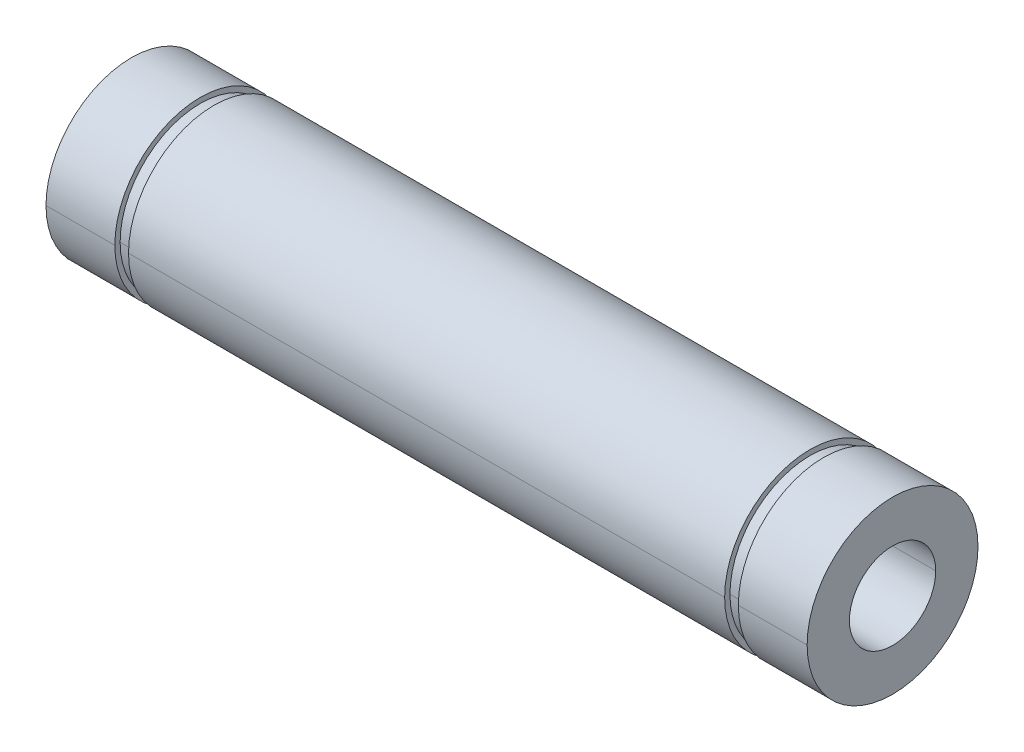
ISO-10303-21;
HEADER;
FILE_DESCRIPTION(('STEP AP214'),'2;1');
FILE_NAME('part.step','',(''),(''),'','','');
FILE_SCHEMA(('AUTOMOTIVE_DESIGN { 1 0 10303 214 1 1 1 1 }'));
ENDSEC;
DATA;
#1=APPLICATION_CONTEXT('core data for automotive mechanical design processes');
#2=APPLICATION_PROTOCOL_DEFINITION('international standard','automotive_design',2000,#1);
#3=PRODUCT_CONTEXT('',#1,'mechanical');
#4=PRODUCT('Part','Part','',(#3));
#5=PRODUCT_RELATED_PRODUCT_CATEGORY('part','',(#4));
#6=PRODUCT_DEFINITION_FORMATION('','',#4);
#7=PRODUCT_DEFINITION_CONTEXT('part definition',#1,'design');
#8=PRODUCT_DEFINITION('design','',#6,#7);
#9=PRODUCT_DEFINITION_SHAPE('','',#8);
#10=(LENGTH_UNIT() NAMED_UNIT(*) SI_UNIT(.MILLI.,.METRE.));
#11=(NAMED_UNIT(*) PLANE_ANGLE_UNIT() SI_UNIT($,.RADIAN.));
#12=(NAMED_UNIT(*) SI_UNIT($,.STERADIAN.) SOLID_ANGLE_UNIT());
#13=UNCERTAINTY_MEASURE_WITH_UNIT(LENGTH_MEASURE(1.E-05),#10,'distance_accuracy_value','');
#14=(GEOMETRIC_REPRESENTATION_CONTEXT(3) GLOBAL_UNCERTAINTY_ASSIGNED_CONTEXT((#13)) GLOBAL_UNIT_ASSIGNED_CONTEXT((#10,
#11,#12)) REPRESENTATION_CONTEXT('',''));
#15=CARTESIAN_POINT('',(0.,0.,0.));
#16=DIRECTION('',(0.,0.,1.));
#17=DIRECTION('',(1.,0.,0.));
#18=AXIS2_PLACEMENT_3D('',#15,#16,#17);
#19=CARTESIAN_POINT('',(28.2321,0.,0.));
#20=DIRECTION('',(1.,0.,0.));
#21=DIRECTION('',(0.,0.,-1.));
#22=AXIS2_PLACEMENT_3D('',#19,#20,#21);
#23=CYLINDRICAL_SURFACE('',#22,3.2004);
#24=DIRECTION('',(1.,0.,0.));
#25=VECTOR('',#24,1.);
#26=CARTESIAN_POINT('',(28.2321,0.,3.2004));
#27=LINE('',#26,#25);
#28=CARTESIAN_POINT('',(-28.2321,0.,3.2004));
#29=VERTEX_POINT('',#28);
#30=CARTESIAN_POINT('',(28.2321,0.,3.2004));
#31=VERTEX_POINT('',#30);
#32=EDGE_CURVE('E166',#29,#31,#27,.T.);
#33=ORIENTED_EDGE('',*,*,#32,.F.);
#34=CARTESIAN_POINT('',(-28.2321,0.,0.));
#35=DIRECTION('',(1.,0.,0.));
#36=DIRECTION('',(0.,0.,-1.));
#37=AXIS2_PLACEMENT_3D('',#34,#35,#36);
#38=CIRCLE('',#37,3.2004);
#39=CARTESIAN_POINT('',(-28.2321,0.,-3.2004));
#40=VERTEX_POINT('',#39);
#41=EDGE_CURVE('E155',#40,#29,#38,.T.);
#42=ORIENTED_EDGE('',*,*,#41,.F.);
#43=DIRECTION('',(1.,0.,0.));
#44=VECTOR('',#43,1.);
#45=CARTESIAN_POINT('',(28.2321,0.,-3.2004));
#46=LINE('',#45,#44);
#47=CARTESIAN_POINT('',(28.2321,0.,-3.2004));
#48=VERTEX_POINT('',#47);
#49=EDGE_CURVE('E158',#40,#48,#46,.T.);
#50=ORIENTED_EDGE('',*,*,#49,.T.);
#51=CARTESIAN_POINT('',(28.2321,0.,0.));
#52=DIRECTION('',(1.,0.,0.));
#53=DIRECTION('',(0.,0.,-1.));
#54=AXIS2_PLACEMENT_3D('',#51,#52,#53);
#55=CIRCLE('',#54,3.2004);
#56=EDGE_CURVE('E145',#48,#31,#55,.T.);
#57=ORIENTED_EDGE('',*,*,#56,.T.);
#58=EDGE_LOOP('',(#33,#42,#50,#57));
#59=FACE_BOUND('',#58,.T.);
#60=ADVANCED_FACE('F17',(#59),#23,.F.);
#61=CARTESIAN_POINT('',(28.2321,0.,0.));
#62=DIRECTION('',(-1.,0.,0.));
#63=DIRECTION('',(0.,0.,1.));
#64=AXIS2_PLACEMENT_3D('',#61,#62,#63);
#65=CYLINDRICAL_SURFACE('',#64,6.3373);
#66=DIRECTION('',(-1.,0.,0.));
#67=VECTOR('',#66,1.);
#68=CARTESIAN_POINT('',(28.2321,0.,-6.3373));
#69=LINE('',#68,#67);
#70=CARTESIAN_POINT('',(22.1107,0.,-6.3373));
#71=VERTEX_POINT('',#70);
#72=CARTESIAN_POINT('',(-22.1107,0.,-6.3373));
#73=VERTEX_POINT('',#72);
#74=EDGE_CURVE('E242',#71,#73,#69,.T.);
#75=ORIENTED_EDGE('',*,*,#74,.F.);
#76=CARTESIAN_POINT('',(22.1107,0.,0.));
#77=DIRECTION('',(-1.,0.,0.));
#78=DIRECTION('',(0.,0.,1.));
#79=AXIS2_PLACEMENT_3D('',#76,#77,#78);
#80=CIRCLE('',#79,6.3373);
#81=CARTESIAN_POINT('',(22.1107,0.,6.3373));
#82=VERTEX_POINT('',#81);
#83=EDGE_CURVE('E192',#71,#82,#80,.T.);
#84=ORIENTED_EDGE('',*,*,#83,.T.);
#85=DIRECTION('',(-1.,0.,0.));
#86=VECTOR('',#85,1.);
#87=CARTESIAN_POINT('',(28.2321,0.,6.3373));
#88=LINE('',#87,#86);
#89=CARTESIAN_POINT('',(-22.1107,0.,6.3373));
#90=VERTEX_POINT('',#89);
#91=EDGE_CURVE('E209',#82,#90,#88,.T.);
#92=ORIENTED_EDGE('',*,*,#91,.T.);
#93=CARTESIAN_POINT('',(-22.1107,0.,0.));
#94=DIRECTION('',(-1.,0.,0.));
#95=DIRECTION('',(0.,0.,1.));
#96=AXIS2_PLACEMENT_3D('',#93,#94,#95);
#97=CIRCLE('',#96,6.3373);
#98=EDGE_CURVE('E11',#73,#90,#97,.T.);
#99=ORIENTED_EDGE('',*,*,#98,.F.);
#100=EDGE_LOOP('',(#75,#84,#92,#99));
#101=FACE_BOUND('',#100,.T.);
#102=ADVANCED_FACE('F303',(#101),#65,.T.);
#103=CARTESIAN_POINT('',(-22.1107,0.,-6.3373));
#104=DIRECTION('',(-1.,0.,0.));
#105=DIRECTION('',(0.,0.,1.));
#106=AXIS2_PLACEMENT_3D('',#103,#104,#105);
#107=PLANE('',#106);
#108=CARTESIAN_POINT('',(-22.1107,0.,0.));
#109=DIRECTION('',(-1.,0.,0.));
#110=DIRECTION('',(0.,0.,1.));
#111=AXIS2_PLACEMENT_3D('',#108,#109,#110);
#112=CIRCLE('',#111,5.9436);
#113=CARTESIAN_POINT('',(-22.1107,0.,5.9436));
#114=VERTEX_POINT('',#113);
#115=CARTESIAN_POINT('',(-22.1107,0.,-5.9436));
#116=VERTEX_POINT('',#115);
#117=EDGE_CURVE('E205',#114,#116,#112,.T.);
#118=ORIENTED_EDGE('',*,*,#117,.F.);
#119=CARTESIAN_POINT('',(-22.1107,0.,0.));
#120=DIRECTION('',(-1.,0.,0.));
#121=DIRECTION('',(0.,0.,1.));
#122=AXIS2_PLACEMENT_3D('',#119,#120,#121);
#123=CIRCLE('',#122,5.9436);
#124=EDGE_CURVE('E28',#116,#114,#123,.T.);
#125=ORIENTED_EDGE('',*,*,#124,.F.);
#126=EDGE_LOOP('',(#118,#125));
#127=FACE_BOUND('',#126,.T.);
#128=CARTESIAN_POINT('',(-22.1107,0.,0.));
#129=DIRECTION('',(-1.,0.,0.));
#130=DIRECTION('',(0.,0.,1.));
#131=AXIS2_PLACEMENT_3D('',#128,#129,#130);
#132=CIRCLE('',#131,6.3373);
#133=EDGE_CURVE('E233',#90,#73,#132,.T.);
#134=ORIENTED_EDGE('',*,*,#133,.T.);
#135=ORIENTED_EDGE('',*,*,#98,.T.);
#136=EDGE_LOOP('',(#134,#135));
#137=FACE_BOUND('',#136,.T.);
#138=ADVANCED_FACE('F309',(#127,#137),#107,.T.);
#139=CARTESIAN_POINT('',(-28.2321,0.,0.));
#140=DIRECTION('',(-1.,0.,0.));
#141=DIRECTION('',(0.,0.,1.));
#142=AXIS2_PLACEMENT_3D('',#139,#140,#141);
#143=CYLINDRICAL_SURFACE('',#142,5.9436);
#144=DIRECTION('',(-1.,0.,0.));
#145=VECTOR('',#144,1.);
#146=CARTESIAN_POINT('',(-28.2321,0.,-5.9436));
#147=LINE('',#146,#145);
#148=CARTESIAN_POINT('',(-23.1267,0.,-5.9436));
#149=VERTEX_POINT('',#148);
#150=EDGE_CURVE('E184',#116,#149,#147,.T.);
#151=ORIENTED_EDGE('',*,*,#150,.F.);
#152=ORIENTED_EDGE('',*,*,#124,.T.);
#153=DIRECTION('',(-1.,0.,0.));
#154=VECTOR('',#153,1.);
#155=CARTESIAN_POINT('',(-28.2321,0.,5.9436));
#156=LINE('',#155,#154);
#157=CARTESIAN_POINT('',(-23.1267,0.,5.9436));
#158=VERTEX_POINT('',#157);
#159=EDGE_CURVE('E183',#114,#158,#156,.T.);
#160=ORIENTED_EDGE('',*,*,#159,.T.);
#161=CARTESIAN_POINT('',(-23.1267,0.,0.));
#162=DIRECTION('',(-1.,0.,0.));
#163=DIRECTION('',(0.,0.,1.));
#164=AXIS2_PLACEMENT_3D('',#161,#162,#163);
#165=CIRCLE('',#164,5.9436);
#166=EDGE_CURVE('E195',#149,#158,#165,.T.);
#167=ORIENTED_EDGE('',*,*,#166,.F.);
#168=EDGE_LOOP('',(#151,#152,#160,#167));
#169=FACE_BOUND('',#168,.T.);
#170=ADVANCED_FACE('F316',(#169),#143,.T.);
#171=CARTESIAN_POINT('',(-23.1267,0.,-6.3373));
#172=DIRECTION('',(1.,0.,0.));
#173=DIRECTION('',(0.,1.,0.));
#174=AXIS2_PLACEMENT_3D('',#171,#172,#173);
#175=PLANE('',#174);
#176=CARTESIAN_POINT('',(-23.1267,0.,0.));
#177=DIRECTION('',(-1.,0.,0.));
#178=DIRECTION('',(0.,0.,1.));
#179=AXIS2_PLACEMENT_3D('',#176,#177,#178);
#180=CIRCLE('',#179,5.9436);
#181=EDGE_CURVE('E180',#158,#149,#180,.T.);
#182=ORIENTED_EDGE('',*,*,#181,.T.);
#183=ORIENTED_EDGE('',*,*,#166,.T.);
#184=EDGE_LOOP('',(#182,#183));
#185=FACE_BOUND('',#184,.T.);
#186=CARTESIAN_POINT('',(-23.1267,0.,0.));
#187=DIRECTION('',(-1.,0.,0.));
#188=DIRECTION('',(0.,0.,1.));
#189=AXIS2_PLACEMENT_3D('',#186,#187,#188);
#190=CIRCLE('',#189,6.3373);
#191=CARTESIAN_POINT('',(-23.1267,0.,6.3373));
#192=VERTEX_POINT('',#191);
#193=CARTESIAN_POINT('',(-23.1267,0.,-6.3373));
#194=VERTEX_POINT('',#193);
#195=EDGE_CURVE('E222',#192,#194,#190,.T.);
#196=ORIENTED_EDGE('',*,*,#195,.F.);
#197=CARTESIAN_POINT('',(-23.1267,0.,0.));
#198=DIRECTION('',(-1.,0.,0.));
#199=DIRECTION('',(0.,0.,1.));
#200=AXIS2_PLACEMENT_3D('',#197,#198,#199);
#201=CIRCLE('',#200,6.3373);
#202=EDGE_CURVE('E188',#194,#192,#201,.T.);
#203=ORIENTED_EDGE('',*,*,#202,.F.);
#204=EDGE_LOOP('',(#196,#203));
#205=FACE_BOUND('',#204,.T.);
#206=ADVANCED_FACE('F329',(#185,#205),#175,.T.);
#207=CARTESIAN_POINT('',(22.1107,0.,-6.3373));
#208=DIRECTION('',(1.,0.,0.));
#209=DIRECTION('',(0.,1.,0.));
#210=AXIS2_PLACEMENT_3D('',#207,#208,#209);
#211=PLANE('',#210);
#212=CARTESIAN_POINT('',(22.1107,0.,0.));
#213=DIRECTION('',(-1.,0.,0.));
#214=DIRECTION('',(0.,0.,1.));
#215=AXIS2_PLACEMENT_3D('',#212,#213,#214);
#216=CIRCLE('',#215,5.9436);
#217=CARTESIAN_POINT('',(22.1107,0.,5.9436));
#218=VERTEX_POINT('',#217);
#219=CARTESIAN_POINT('',(22.1107,0.,-5.9436));
#220=VERTEX_POINT('',#219);
#221=EDGE_CURVE('E204',#218,#220,#216,.T.);
#222=ORIENTED_EDGE('',*,*,#221,.T.);
#223=CARTESIAN_POINT('',(22.1107,0.,0.));
#224=DIRECTION('',(-1.,0.,0.));
#225=DIRECTION('',(0.,0.,1.));
#226=AXIS2_PLACEMENT_3D('',#223,#224,#225);
#227=CIRCLE('',#226,5.9436);
#228=EDGE_CURVE('E58',#220,#218,#227,.T.);
#229=ORIENTED_EDGE('',*,*,#228,.T.);
#230=EDGE_LOOP('',(#222,#229));
#231=FACE_BOUND('',#230,.T.);
#232=CARTESIAN_POINT('',(22.1107,0.,0.));
#233=DIRECTION('',(-1.,0.,0.));
#234=DIRECTION('',(0.,0.,1.));
#235=AXIS2_PLACEMENT_3D('',#232,#233,#234);
#236=CIRCLE('',#235,6.3373);
#237=EDGE_CURVE('E163',#82,#71,#236,.T.);
#238=ORIENTED_EDGE('',*,*,#237,.F.);
#239=ORIENTED_EDGE('',*,*,#83,.F.);
#240=EDGE_LOOP('',(#238,#239));
#241=FACE_BOUND('',#240,.T.);
#242=ADVANCED_FACE('F313',(#231,#241),#211,.T.);
#243=CARTESIAN_POINT('',(-28.2321,0.,0.));
#244=DIRECTION('',(-1.,0.,0.));
#245=DIRECTION('',(0.,0.,1.));
#246=AXIS2_PLACEMENT_3D('',#243,#244,#245);
#247=CYLINDRICAL_SURFACE('',#246,5.9436);
#248=DIRECTION('',(-1.,0.,0.));
#249=VECTOR('',#248,1.);
#250=CARTESIAN_POINT('',(-28.2321,0.,-5.9436));
#251=LINE('',#250,#249);
#252=CARTESIAN_POINT('',(23.1267,0.,-5.9436));
#253=VERTEX_POINT('',#252);
#254=EDGE_CURVE('E215',#253,#220,#251,.T.);
#255=ORIENTED_EDGE('',*,*,#254,.F.);
#256=CARTESIAN_POINT('',(23.1267,0.,0.));
#257=DIRECTION('',(-1.,0.,0.));
#258=DIRECTION('',(0.,0.,1.));
#259=AXIS2_PLACEMENT_3D('',#256,#257,#258);
#260=CIRCLE('',#259,5.9436);
#261=CARTESIAN_POINT('',(23.1267,0.,5.9436));
#262=VERTEX_POINT('',#261);
#263=EDGE_CURVE('E190',#253,#262,#260,.T.);
#264=ORIENTED_EDGE('',*,*,#263,.T.);
#265=DIRECTION('',(-1.,0.,0.));
#266=VECTOR('',#265,1.);
#267=CARTESIAN_POINT('',(-28.2321,0.,5.9436));
#268=LINE('',#267,#266);
#269=EDGE_CURVE('E200',#262,#218,#268,.T.);
#270=ORIENTED_EDGE('',*,*,#269,.T.);
#271=ORIENTED_EDGE('',*,*,#228,.F.);
#272=EDGE_LOOP('',(#255,#264,#270,#271));
#273=FACE_BOUND('',#272,.T.);
#274=ADVANCED_FACE('F331',(#273),#247,.T.);
#275=CARTESIAN_POINT('',(23.1267,0.,-6.3373));
#276=DIRECTION('',(-1.,0.,0.));
#277=DIRECTION('',(0.,0.,1.));
#278=AXIS2_PLACEMENT_3D('',#275,#276,#277);
#279=PLANE('',#278);
#280=CARTESIAN_POINT('',(23.1267,0.,0.));
#281=DIRECTION('',(-1.,0.,0.));
#282=DIRECTION('',(0.,0.,1.));
#283=AXIS2_PLACEMENT_3D('',#280,#281,#282);
#284=CIRCLE('',#283,5.9436);
#285=EDGE_CURVE('E219',#262,#253,#284,.T.);
#286=ORIENTED_EDGE('',*,*,#285,.F.);
#287=ORIENTED_EDGE('',*,*,#263,.F.);
#288=EDGE_LOOP('',(#286,#287));
#289=FACE_BOUND('',#288,.T.);
#290=CARTESIAN_POINT('',(23.1267,0.,0.));
#291=DIRECTION('',(-1.,0.,0.));
#292=DIRECTION('',(0.,0.,1.));
#293=AXIS2_PLACEMENT_3D('',#290,#291,#292);
#294=CIRCLE('',#293,6.3373);
#295=CARTESIAN_POINT('',(23.1267,0.,6.3373));
#296=VERTEX_POINT('',#295);
#297=CARTESIAN_POINT('',(23.1267,0.,-6.3373));
#298=VERTEX_POINT('',#297);
#299=EDGE_CURVE('E230',#296,#298,#294,.T.);
#300=ORIENTED_EDGE('',*,*,#299,.T.);
#301=CARTESIAN_POINT('',(23.1267,0.,0.));
#302=DIRECTION('',(-1.,0.,0.));
#303=DIRECTION('',(0.,0.,1.));
#304=AXIS2_PLACEMENT_3D('',#301,#302,#303);
#305=CIRCLE('',#304,6.3373);
#306=EDGE_CURVE('E122',#298,#296,#305,.T.);
#307=ORIENTED_EDGE('',*,*,#306,.T.);
#308=EDGE_LOOP('',(#300,#307));
#309=FACE_BOUND('',#308,.T.);
#310=ADVANCED_FACE('F283',(#289,#309),#279,.T.);
#311=CARTESIAN_POINT('',(-28.2321,0.,0.));
#312=DIRECTION('',(1.,0.,0.));
#313=DIRECTION('',(0.,1.,0.));
#314=AXIS2_PLACEMENT_3D('',#311,#312,#313);
#315=PLANE('',#314);
#316=ORIENTED_EDGE('',*,*,#41,.T.);
#317=CARTESIAN_POINT('',(-28.2321,0.,0.));
#318=DIRECTION('',(1.,0.,0.));
#319=DIRECTION('',(0.,0.,-1.));
#320=AXIS2_PLACEMENT_3D('',#317,#318,#319);
#321=CIRCLE('',#320,3.2004);
#322=EDGE_CURVE('E174',#29,#40,#321,.T.);
#323=ORIENTED_EDGE('',*,*,#322,.T.);
#324=EDGE_LOOP('',(#316,#323));
#325=FACE_BOUND('',#324,.T.);
#326=CARTESIAN_POINT('',(-28.2321,0.,0.));
#327=DIRECTION('',(1.,0.,0.));
#328=DIRECTION('',(0.,0.,-1.));
#329=AXIS2_PLACEMENT_3D('',#326,#327,#328);
#330=CIRCLE('',#329,6.3373);
#331=CARTESIAN_POINT('',(-28.2321,0.,6.3373));
#332=VERTEX_POINT('',#331);
#333=CARTESIAN_POINT('',(-28.2321,0.,-6.3373));
#334=VERTEX_POINT('',#333);
#335=EDGE_CURVE('E42',#332,#334,#330,.T.);
#336=ORIENTED_EDGE('',*,*,#335,.F.);
#337=CARTESIAN_POINT('',(-28.2321,0.,0.));
#338=DIRECTION('',(1.,0.,0.));
#339=DIRECTION('',(0.,0.,-1.));
#340=AXIS2_PLACEMENT_3D('',#337,#338,#339);
#341=CIRCLE('',#340,6.3373);
#342=EDGE_CURVE('E255',#334,#332,#341,.T.);
#343=ORIENTED_EDGE('',*,*,#342,.F.);
#344=EDGE_LOOP('',(#336,#343));
#345=FACE_BOUND('',#344,.T.);
#346=ADVANCED_FACE('F290',(#325,#345),#315,.F.);
#347=CARTESIAN_POINT('',(28.2321,0.,0.));
#348=DIRECTION('',(1.,0.,0.));
#349=DIRECTION('',(0.,1.,0.));
#350=AXIS2_PLACEMENT_3D('',#347,#348,#349);
#351=PLANE('',#350);
#352=ORIENTED_EDGE('',*,*,#56,.F.);
#353=CARTESIAN_POINT('',(28.2321,0.,0.));
#354=DIRECTION('',(1.,0.,0.));
#355=DIRECTION('',(0.,0.,-1.));
#356=AXIS2_PLACEMENT_3D('',#353,#354,#355);
#357=CIRCLE('',#356,3.2004);
#358=EDGE_CURVE('E150',#31,#48,#357,.T.);
#359=ORIENTED_EDGE('',*,*,#358,.F.);
#360=EDGE_LOOP('',(#352,#359));
#361=FACE_BOUND('',#360,.T.);
#362=CARTESIAN_POINT('',(28.2321,0.,0.));
#363=DIRECTION('',(1.,0.,0.));
#364=DIRECTION('',(0.,0.,-1.));
#365=AXIS2_PLACEMENT_3D('',#362,#363,#364);
#366=CIRCLE('',#365,6.3373);
#367=CARTESIAN_POINT('',(28.2321,0.,6.3373));
#368=VERTEX_POINT('',#367);
#369=CARTESIAN_POINT('',(28.2321,0.,-6.3373));
#370=VERTEX_POINT('',#369);
#371=EDGE_CURVE('E187',#368,#370,#366,.T.);
#372=ORIENTED_EDGE('',*,*,#371,.T.);
#373=CARTESIAN_POINT('',(28.2321,0.,0.));
#374=DIRECTION('',(1.,0.,0.));
#375=DIRECTION('',(0.,0.,-1.));
#376=AXIS2_PLACEMENT_3D('',#373,#374,#375);
#377=CIRCLE('',#376,6.3373);
#378=EDGE_CURVE('E203',#370,#368,#377,.T.);
#379=ORIENTED_EDGE('',*,*,#378,.T.);
#380=EDGE_LOOP('',(#372,#379));
#381=FACE_BOUND('',#380,.T.);
#382=ADVANCED_FACE('F147',(#361,#381),#351,.T.);
#383=CARTESIAN_POINT('',(28.2321,0.,0.));
#384=DIRECTION('',(-1.,0.,0.));
#385=DIRECTION('',(0.,0.,1.));
#386=AXIS2_PLACEMENT_3D('',#383,#384,#385);
#387=CYLINDRICAL_SURFACE('',#386,6.3373);
#388=DIRECTION('',(-1.,0.,0.));
#389=VECTOR('',#388,1.);
#390=CARTESIAN_POINT('',(28.2321,0.,-6.3373));
#391=LINE('',#390,#389);
#392=EDGE_CURVE('E259',#370,#298,#391,.T.);
#393=ORIENTED_EDGE('',*,*,#392,.F.);
#394=ORIENTED_EDGE('',*,*,#371,.F.);
#395=DIRECTION('',(-1.,0.,0.));
#396=VECTOR('',#395,1.);
#397=CARTESIAN_POINT('',(28.2321,0.,6.3373));
#398=LINE('',#397,#396);
#399=EDGE_CURVE('E225',#368,#296,#398,.T.);
#400=ORIENTED_EDGE('',*,*,#399,.T.);
#401=ORIENTED_EDGE('',*,*,#306,.F.);
#402=EDGE_LOOP('',(#393,#394,#400,#401));
#403=FACE_BOUND('',#402,.T.);
#404=ADVANCED_FACE('F288',(#403),#387,.T.);
#405=CARTESIAN_POINT('',(28.2321,0.,0.));
#406=DIRECTION('',(-1.,0.,0.));
#407=DIRECTION('',(0.,0.,1.));
#408=AXIS2_PLACEMENT_3D('',#405,#406,#407);
#409=CYLINDRICAL_SURFACE('',#408,6.3373);
#410=DIRECTION('',(-1.,0.,0.));
#411=VECTOR('',#410,1.);
#412=CARTESIAN_POINT('',(28.2321,0.,-6.3373));
#413=LINE('',#412,#411);
#414=EDGE_CURVE('E21',#194,#334,#413,.T.);
#415=ORIENTED_EDGE('',*,*,#414,.F.);
#416=ORIENTED_EDGE('',*,*,#202,.T.);
#417=DIRECTION('',(-1.,0.,0.));
#418=VECTOR('',#417,1.);
#419=CARTESIAN_POINT('',(28.2321,0.,6.3373));
#420=LINE('',#419,#418);
#421=EDGE_CURVE('E178',#192,#332,#420,.T.);
#422=ORIENTED_EDGE('',*,*,#421,.T.);
#423=ORIENTED_EDGE('',*,*,#335,.T.);
#424=EDGE_LOOP('',(#415,#416,#422,#423));
#425=FACE_BOUND('',#424,.T.);
#426=ADVANCED_FACE('F297',(#425),#409,.T.);
#427=CARTESIAN_POINT('',(28.2321,0.,0.));
#428=DIRECTION('',(-1.,0.,0.));
#429=DIRECTION('',(0.,0.,1.));
#430=AXIS2_PLACEMENT_3D('',#427,#428,#429);
#431=CYLINDRICAL_SURFACE('',#430,6.3373);
#432=ORIENTED_EDGE('',*,*,#195,.T.);
#433=ORIENTED_EDGE('',*,*,#414,.T.);
#434=ORIENTED_EDGE('',*,*,#342,.T.);
#435=ORIENTED_EDGE('',*,*,#421,.F.);
#436=EDGE_LOOP('',(#432,#433,#434,#435));
#437=FACE_BOUND('',#436,.T.);
#438=ADVANCED_FACE('F324',(#437),#431,.T.);
#439=CARTESIAN_POINT('',(28.2321,0.,0.));
#440=DIRECTION('',(-1.,0.,0.));
#441=DIRECTION('',(0.,0.,1.));
#442=AXIS2_PLACEMENT_3D('',#439,#440,#441);
#443=CYLINDRICAL_SURFACE('',#442,6.3373);
#444=ORIENTED_EDGE('',*,*,#378,.F.);
#445=ORIENTED_EDGE('',*,*,#392,.T.);
#446=ORIENTED_EDGE('',*,*,#299,.F.);
#447=ORIENTED_EDGE('',*,*,#399,.F.);
#448=EDGE_LOOP('',(#444,#445,#446,#447));
#449=FACE_BOUND('',#448,.T.);
#450=ADVANCED_FACE('F287',(#449),#443,.T.);
#451=CARTESIAN_POINT('',(-28.2321,0.,0.));
#452=DIRECTION('',(-1.,0.,0.));
#453=DIRECTION('',(0.,0.,1.));
#454=AXIS2_PLACEMENT_3D('',#451,#452,#453);
#455=CYLINDRICAL_SURFACE('',#454,5.9436);
#456=ORIENTED_EDGE('',*,*,#285,.T.);
#457=ORIENTED_EDGE('',*,*,#254,.T.);
#458=ORIENTED_EDGE('',*,*,#221,.F.);
#459=ORIENTED_EDGE('',*,*,#269,.F.);
#460=EDGE_LOOP('',(#456,#457,#458,#459));
#461=FACE_BOUND('',#460,.T.);
#462=ADVANCED_FACE('F318',(#461),#455,.T.);
#463=CARTESIAN_POINT('',(-28.2321,0.,0.));
#464=DIRECTION('',(-1.,0.,0.));
#465=DIRECTION('',(0.,0.,1.));
#466=AXIS2_PLACEMENT_3D('',#463,#464,#465);
#467=CYLINDRICAL_SURFACE('',#466,5.9436);
#468=ORIENTED_EDGE('',*,*,#117,.T.);
#469=ORIENTED_EDGE('',*,*,#150,.T.);
#470=ORIENTED_EDGE('',*,*,#181,.F.);
#471=ORIENTED_EDGE('',*,*,#159,.F.);
#472=EDGE_LOOP('',(#468,#469,#470,#471));
#473=FACE_BOUND('',#472,.T.);
#474=ADVANCED_FACE('F19',(#473),#467,.T.);
#475=CARTESIAN_POINT('',(28.2321,0.,0.));
#476=DIRECTION('',(-1.,0.,0.));
#477=DIRECTION('',(0.,0.,1.));
#478=AXIS2_PLACEMENT_3D('',#475,#476,#477);
#479=CYLINDRICAL_SURFACE('',#478,6.3373);
#480=ORIENTED_EDGE('',*,*,#237,.T.);
#481=ORIENTED_EDGE('',*,*,#74,.T.);
#482=ORIENTED_EDGE('',*,*,#133,.F.);
#483=ORIENTED_EDGE('',*,*,#91,.F.);
#484=EDGE_LOOP('',(#480,#481,#482,#483));
#485=FACE_BOUND('',#484,.T.);
#486=ADVANCED_FACE('F348',(#485),#479,.T.);
#487=CARTESIAN_POINT('',(28.2321,0.,0.));
#488=DIRECTION('',(1.,0.,0.));
#489=DIRECTION('',(0.,0.,-1.));
#490=AXIS2_PLACEMENT_3D('',#487,#488,#489);
#491=CYLINDRICAL_SURFACE('',#490,3.2004);
#492=ORIENTED_EDGE('',*,*,#322,.F.);
#493=ORIENTED_EDGE('',*,*,#32,.T.);
#494=ORIENTED_EDGE('',*,*,#358,.T.);
#495=ORIENTED_EDGE('',*,*,#49,.F.);
#496=EDGE_LOOP('',(#492,#493,#494,#495));
#497=FACE_BOUND('',#496,.T.);
#498=ADVANCED_FACE('F165',(#497),#491,.F.);
#499=CLOSED_SHELL('',(#60,#102,#138,#170,#206,#242,#274,#310,#346,#382,#404,#426,#438,#450,#462,
#474,#486,#498));
#500=MANIFOLD_SOLID_BREP('B1',#499);
#501=ADVANCED_BREP_SHAPE_REPRESENTATION('',(#18,#500),#14);
#502=SHAPE_DEFINITION_REPRESENTATION(#9,#501);
ENDSEC;
END-ISO-10303-21;
